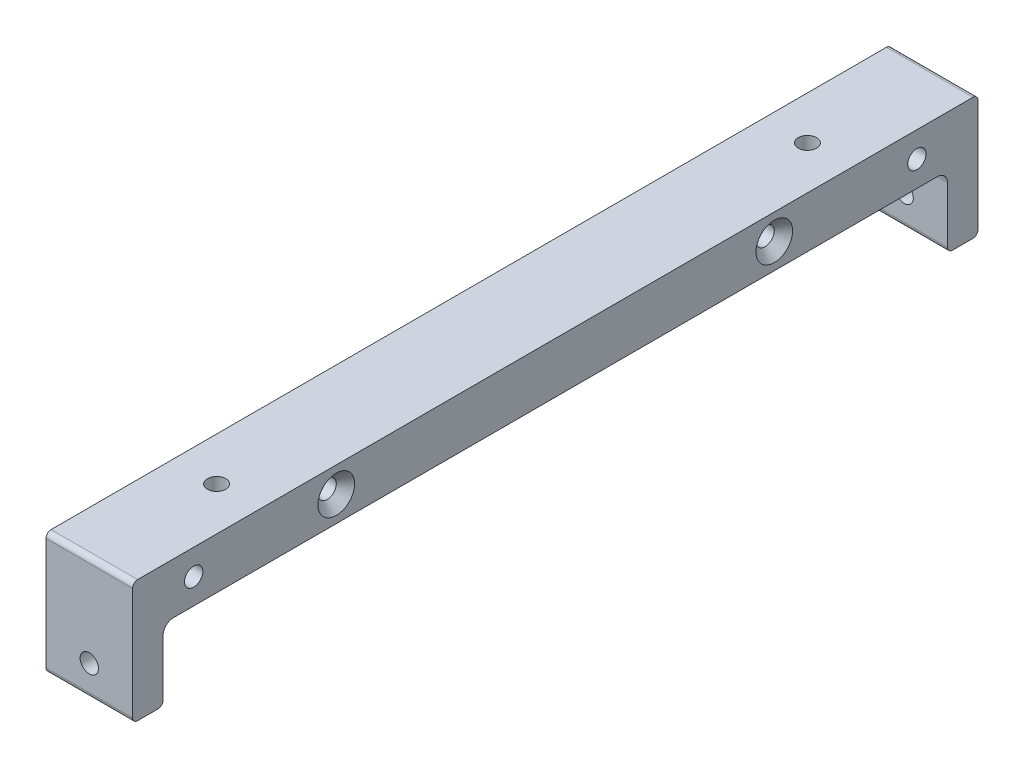
ISO-10303-21;
HEADER;
FILE_DESCRIPTION(('STEP AP214'),'2;1');
FILE_NAME('part.step','',(''),(''),'','','');
FILE_SCHEMA(('AUTOMOTIVE_DESIGN { 1 0 10303 214 1 1 1 1 }'));
ENDSEC;
DATA;
#1=APPLICATION_CONTEXT('core data for automotive mechanical design processes');
#2=APPLICATION_PROTOCOL_DEFINITION('international standard','automotive_design',2000,#1);
#3=PRODUCT_CONTEXT('',#1,'mechanical');
#4=PRODUCT('Part','Part','',(#3));
#5=PRODUCT_RELATED_PRODUCT_CATEGORY('part','',(#4));
#6=PRODUCT_DEFINITION_FORMATION('','',#4);
#7=PRODUCT_DEFINITION_CONTEXT('part definition',#1,'design');
#8=PRODUCT_DEFINITION('design','',#6,#7);
#9=PRODUCT_DEFINITION_SHAPE('','',#8);
#10=(LENGTH_UNIT() NAMED_UNIT(*) SI_UNIT(.MILLI.,.METRE.));
#11=(NAMED_UNIT(*) PLANE_ANGLE_UNIT() SI_UNIT($,.RADIAN.));
#12=(NAMED_UNIT(*) SI_UNIT($,.STERADIAN.) SOLID_ANGLE_UNIT());
#13=UNCERTAINTY_MEASURE_WITH_UNIT(LENGTH_MEASURE(1.E-05),#10,'distance_accuracy_value','');
#14=(GEOMETRIC_REPRESENTATION_CONTEXT(3) GLOBAL_UNCERTAINTY_ASSIGNED_CONTEXT((#13)) GLOBAL_UNIT_ASSIGNED_CONTEXT((#10,
#11,#12)) REPRESENTATION_CONTEXT('',''));
#15=CARTESIAN_POINT('',(0.,0.,0.));
#16=DIRECTION('',(0.,0.,1.));
#17=DIRECTION('',(1.,0.,0.));
#18=AXIS2_PLACEMENT_3D('',#15,#16,#17);
#19=CARTESIAN_POINT('',(-4.25,-6.,41.5));
#20=DIRECTION('',(0.,1.,0.));
#21=DIRECTION('',(0.,0.,1.));
#22=AXIS2_PLACEMENT_3D('',#19,#20,#21);
#23=PLANE('',#22);
#24=DIRECTION('',(0.,0.,-1.));
#25=VECTOR('',#24,1.);
#26=CARTESIAN_POINT('',(-4.25,-6.,41.5));
#27=LINE('',#26,#25);
#28=CARTESIAN_POINT('',(-4.25,-6.,41.));
#29=VERTEX_POINT('',#28);
#30=CARTESIAN_POINT('',(-4.25,-6.,39.));
#31=VERTEX_POINT('',#30);
#32=EDGE_CURVE('E281',#29,#31,#27,.T.);
#33=ORIENTED_EDGE('',*,*,#32,.T.);
#34=DIRECTION('',(1.,0.,0.));
#35=VECTOR('',#34,1.);
#36=CARTESIAN_POINT('',(-4.25,-6.,39.));
#37=LINE('',#36,#35);
#38=CARTESIAN_POINT('',(4.25,-6.,39.));
#39=VERTEX_POINT('',#38);
#40=EDGE_CURVE('E326',#31,#39,#37,.T.);
#41=ORIENTED_EDGE('',*,*,#40,.T.);
#42=DIRECTION('',(0.,0.,-1.));
#43=VECTOR('',#42,1.);
#44=CARTESIAN_POINT('',(4.25,-6.,41.5));
#45=LINE('',#44,#43);
#46=CARTESIAN_POINT('',(4.25,-6.,41.));
#47=VERTEX_POINT('',#46);
#48=EDGE_CURVE('E277',#47,#39,#45,.T.);
#49=ORIENTED_EDGE('',*,*,#48,.F.);
#50=DIRECTION('',(1.,0.,0.));
#51=VECTOR('',#50,1.);
#52=CARTESIAN_POINT('',(-4.25,-6.,41.));
#53=LINE('',#52,#51);
#54=EDGE_CURVE('E324',#47,#29,#53,.F.);
#55=ORIENTED_EDGE('',*,*,#54,.T.);
#56=EDGE_LOOP('',(#33,#41,#49,#55));
#57=FACE_BOUND('',#56,.T.);
#58=ADVANCED_FACE('F33',(#57),#23,.F.);
#59=CARTESIAN_POINT('',(4.25,-6.,41.5));
#60=DIRECTION('',(-1.,0.,0.));
#61=DIRECTION('',(0.,0.,1.));
#62=AXIS2_PLACEMENT_3D('',#59,#60,#61);
#63=PLANE('',#62);
#64=CARTESIAN_POINT('',(4.25,3.5,35.5));
#65=DIRECTION('',(1.,0.,0.));
#66=DIRECTION('',(0.,0.,-1.));
#67=AXIS2_PLACEMENT_3D('',#64,#65,#66);
#68=CIRCLE('',#67,0.89999999999999);
#69=CARTESIAN_POINT('',(4.25,3.5,34.6));
#70=VERTEX_POINT('',#69);
#71=EDGE_CURVE('E188',#70,#70,#68,.T.);
#72=ORIENTED_EDGE('',*,*,#71,.F.);
#73=EDGE_LOOP('',(#72));
#74=FACE_BOUND('',#73,.T.);
#75=CARTESIAN_POINT('',(4.25,3.5,-35.5));
#76=DIRECTION('',(1.,0.,0.));
#77=DIRECTION('',(0.,0.,-1.));
#78=AXIS2_PLACEMENT_3D('',#75,#76,#77);
#79=CIRCLE('',#78,0.899999999999989);
#80=CARTESIAN_POINT('',(4.25,3.5,-36.4));
#81=VERTEX_POINT('',#80);
#82=EDGE_CURVE('E194',#81,#81,#79,.T.);
#83=ORIENTED_EDGE('',*,*,#82,.F.);
#84=EDGE_LOOP('',(#83));
#85=FACE_BOUND('',#84,.T.);
#86=CARTESIAN_POINT('',(4.25,3.5,21.5));
#87=DIRECTION('',(1.,0.,0.));
#88=DIRECTION('',(0.,0.,-1.));
#89=AXIS2_PLACEMENT_3D('',#86,#87,#88);
#90=CIRCLE('',#89,1.8);
#91=CARTESIAN_POINT('',(4.25,3.5,19.7));
#92=VERTEX_POINT('',#91);
#93=EDGE_CURVE('E209',#92,#92,#90,.T.);
#94=ORIENTED_EDGE('',*,*,#93,.F.);
#95=EDGE_LOOP('',(#94));
#96=FACE_BOUND('',#95,.T.);
#97=CARTESIAN_POINT('',(4.25,3.5,-21.5));
#98=DIRECTION('',(1.,0.,0.));
#99=DIRECTION('',(0.,0.,-1.));
#100=AXIS2_PLACEMENT_3D('',#97,#98,#99);
#101=CIRCLE('',#100,1.8);
#102=CARTESIAN_POINT('',(4.25,3.5,-23.3));
#103=VERTEX_POINT('',#102);
#104=EDGE_CURVE('E218',#103,#103,#101,.T.);
#105=ORIENTED_EDGE('',*,*,#104,.F.);
#106=EDGE_LOOP('',(#105));
#107=FACE_BOUND('',#106,.T.);
#108=CARTESIAN_POINT('',(4.25,-6.,-39.));
#109=VERTEX_POINT('',#108);
#110=CARTESIAN_POINT('',(4.25,-6.,-41.));
#111=VERTEX_POINT('',#110);
#112=EDGE_CURVE('E272',#109,#111,#45,.T.);
#113=ORIENTED_EDGE('',*,*,#112,.T.);
#114=CARTESIAN_POINT('',(4.25,-5.5,-41.));
#115=DIRECTION('',(-1.,0.,0.));
#116=DIRECTION('',(0.,0.,1.));
#117=AXIS2_PLACEMENT_3D('',#114,#115,#116);
#118=CIRCLE('',#117,0.5);
#119=CARTESIAN_POINT('',(4.25,-5.5,-41.5));
#120=VERTEX_POINT('',#119);
#121=EDGE_CURVE('E305',#111,#120,#118,.F.);
#122=ORIENTED_EDGE('',*,*,#121,.T.);
#123=DIRECTION('',(0.,1.,0.));
#124=VECTOR('',#123,1.);
#125=CARTESIAN_POINT('',(4.25,-6.,-41.5));
#126=LINE('',#125,#124);
#127=CARTESIAN_POINT('',(4.25,5.5,-41.5));
#128=VERTEX_POINT('',#127);
#129=EDGE_CURVE('E258',#120,#128,#126,.T.);
#130=ORIENTED_EDGE('',*,*,#129,.T.);
#131=CARTESIAN_POINT('',(4.25,5.5,-41.));
#132=DIRECTION('',(-1.,0.,0.));
#133=DIRECTION('',(0.,0.,1.));
#134=AXIS2_PLACEMENT_3D('',#131,#132,#133);
#135=CIRCLE('',#134,0.5);
#136=CARTESIAN_POINT('',(4.25,6.,-41.));
#137=VERTEX_POINT('',#136);
#138=EDGE_CURVE('E297',#128,#137,#135,.F.);
#139=ORIENTED_EDGE('',*,*,#138,.T.);
#140=DIRECTION('',(0.,0.,-1.));
#141=VECTOR('',#140,1.);
#142=CARTESIAN_POINT('',(4.25,6.,41.5));
#143=LINE('',#142,#141);
#144=CARTESIAN_POINT('',(4.25,6.,41.));
#145=VERTEX_POINT('',#144);
#146=EDGE_CURVE('E287',#145,#137,#143,.T.);
#147=ORIENTED_EDGE('',*,*,#146,.F.);
#148=CARTESIAN_POINT('',(4.25,5.5,41.));
#149=DIRECTION('',(-1.,0.,0.));
#150=DIRECTION('',(0.,0.,1.));
#151=AXIS2_PLACEMENT_3D('',#148,#149,#150);
#152=CIRCLE('',#151,0.5);
#153=CARTESIAN_POINT('',(4.25,5.5,41.5));
#154=VERTEX_POINT('',#153);
#155=EDGE_CURVE('E295',#145,#154,#152,.F.);
#156=ORIENTED_EDGE('',*,*,#155,.T.);
#157=DIRECTION('',(0.,1.,0.));
#158=VECTOR('',#157,1.);
#159=CARTESIAN_POINT('',(4.25,-6.,41.5));
#160=LINE('',#159,#158);
#161=CARTESIAN_POINT('',(4.25,-5.5,41.5));
#162=VERTEX_POINT('',#161);
#163=EDGE_CURVE('E265',#162,#154,#160,.T.);
#164=ORIENTED_EDGE('',*,*,#163,.F.);
#165=CARTESIAN_POINT('',(4.25,-5.5,41.));
#166=DIRECTION('',(-1.,0.,0.));
#167=DIRECTION('',(0.,0.,1.));
#168=AXIS2_PLACEMENT_3D('',#165,#166,#167);
#169=CIRCLE('',#168,0.5);
#170=EDGE_CURVE('E299',#162,#47,#169,.F.);
#171=ORIENTED_EDGE('',*,*,#170,.T.);
#172=ORIENTED_EDGE('',*,*,#48,.T.);
#173=CARTESIAN_POINT('',(4.25,-5.5,39.));
#174=DIRECTION('',(-1.,0.,0.));
#175=DIRECTION('',(0.,0.,1.));
#176=AXIS2_PLACEMENT_3D('',#173,#174,#175);
#177=CIRCLE('',#176,0.5);
#178=CARTESIAN_POINT('',(4.25,-5.5,38.5));
#179=VERTEX_POINT('',#178);
#180=EDGE_CURVE('E301',#39,#179,#177,.F.);
#181=ORIENTED_EDGE('',*,*,#180,.T.);
#182=DIRECTION('',(0.,-1.,0.));
#183=VECTOR('',#182,1.);
#184=CARTESIAN_POINT('',(4.25,-6.00000000000001,38.5));
#185=LINE('',#184,#183);
#186=CARTESIAN_POINT('',(4.25,0.,38.5));
#187=VERTEX_POINT('',#186);
#188=EDGE_CURVE('E231',#187,#179,#185,.T.);
#189=ORIENTED_EDGE('',*,*,#188,.F.);
#190=CARTESIAN_POINT('',(4.25,0.,37.5));
#191=DIRECTION('',(1.,0.,0.));
#192=DIRECTION('',(0.,0.,-1.));
#193=AXIS2_PLACEMENT_3D('',#190,#191,#192);
#194=CIRCLE('',#193,1.);
#195=CARTESIAN_POINT('',(4.25,1.,37.5));
#196=VERTEX_POINT('',#195);
#197=EDGE_CURVE('E251',#196,#187,#194,.T.);
#198=ORIENTED_EDGE('',*,*,#197,.F.);
#199=DIRECTION('',(0.,0.,1.));
#200=VECTOR('',#199,1.);
#201=CARTESIAN_POINT('',(4.25,1.,37.5));
#202=LINE('',#201,#200);
#203=CARTESIAN_POINT('',(4.25,1.,-37.5));
#204=VERTEX_POINT('',#203);
#205=EDGE_CURVE('E248',#204,#196,#202,.T.);
#206=ORIENTED_EDGE('',*,*,#205,.F.);
#207=CARTESIAN_POINT('',(4.25,0.,-37.5));
#208=DIRECTION('',(1.,0.,0.));
#209=DIRECTION('',(0.,0.,1.));
#210=AXIS2_PLACEMENT_3D('',#207,#208,#209);
#211=CIRCLE('',#210,1.);
#212=CARTESIAN_POINT('',(4.25,0.,-38.5));
#213=VERTEX_POINT('',#212);
#214=EDGE_CURVE('E245',#213,#204,#211,.T.);
#215=ORIENTED_EDGE('',*,*,#214,.F.);
#216=DIRECTION('',(0.,1.,0.));
#217=VECTOR('',#216,1.);
#218=CARTESIAN_POINT('',(4.25,0.,-38.5));
#219=LINE('',#218,#217);
#220=CARTESIAN_POINT('',(4.25,-5.5,-38.5));
#221=VERTEX_POINT('',#220);
#222=EDGE_CURVE('E227',#221,#213,#219,.T.);
#223=ORIENTED_EDGE('',*,*,#222,.F.);
#224=CARTESIAN_POINT('',(4.25,-5.5,-39.));
#225=DIRECTION('',(-1.,0.,0.));
#226=DIRECTION('',(0.,0.,1.));
#227=AXIS2_PLACEMENT_3D('',#224,#225,#226);
#228=CIRCLE('',#227,0.5);
#229=EDGE_CURVE('E303',#221,#109,#228,.F.);
#230=ORIENTED_EDGE('',*,*,#229,.T.);
#231=EDGE_LOOP('',(#113,#122,#130,#139,#147,#156,#164,#171,#172,#181,#189,#198,#206,#215,#223,#230));
#232=FACE_BOUND('',#231,.T.);
#233=ADVANCED_FACE('F346',(#74,#85,#96,#107,#232),#63,.F.);
#234=CARTESIAN_POINT('',(-4.25,6.,41.5));
#235=DIRECTION('',(0.,-1.,0.));
#236=DIRECTION('',(0.,0.,-1.));
#237=AXIS2_PLACEMENT_3D('',#234,#235,#236);
#238=PLANE('',#237);
#239=CARTESIAN_POINT('',(0.,6.,-29.));
#240=DIRECTION('',(0.,1.,0.));
#241=DIRECTION('',(0.,0.,1.));
#242=AXIS2_PLACEMENT_3D('',#239,#240,#241);
#243=CIRCLE('',#242,0.899999999999989);
#244=CARTESIAN_POINT('',(0.,6.,-28.1));
#245=VERTEX_POINT('',#244);
#246=EDGE_CURVE('E172',#245,#245,#243,.T.);
#247=ORIENTED_EDGE('',*,*,#246,.F.);
#248=EDGE_LOOP('',(#247));
#249=FACE_BOUND('',#248,.T.);
#250=CARTESIAN_POINT('',(0.,6.,29.));
#251=DIRECTION('',(0.,1.,0.));
#252=DIRECTION('',(0.,0.,1.));
#253=AXIS2_PLACEMENT_3D('',#250,#251,#252);
#254=CIRCLE('',#253,0.899999999999989);
#255=CARTESIAN_POINT('',(0.,6.,29.9));
#256=VERTEX_POINT('',#255);
#257=EDGE_CURVE('E171',#256,#256,#254,.T.);
#258=ORIENTED_EDGE('',*,*,#257,.F.);
#259=EDGE_LOOP('',(#258));
#260=FACE_BOUND('',#259,.T.);
#261=ORIENTED_EDGE('',*,*,#146,.T.);
#262=DIRECTION('',(-1.,0.,0.));
#263=VECTOR('',#262,1.);
#264=CARTESIAN_POINT('',(-4.25,6.,-41.));
#265=LINE('',#264,#263);
#266=CARTESIAN_POINT('',(-4.25,6.,-41.));
#267=VERTEX_POINT('',#266);
#268=EDGE_CURVE('E11',#137,#267,#265,.T.);
#269=ORIENTED_EDGE('',*,*,#268,.T.);
#270=DIRECTION('',(0.,0.,-1.));
#271=VECTOR('',#270,1.);
#272=CARTESIAN_POINT('',(-4.25,6.,41.5));
#273=LINE('',#272,#271);
#274=CARTESIAN_POINT('',(-4.25,6.,41.));
#275=VERTEX_POINT('',#274);
#276=EDGE_CURVE('E284',#275,#267,#273,.T.);
#277=ORIENTED_EDGE('',*,*,#276,.F.);
#278=DIRECTION('',(-1.,0.,0.));
#279=VECTOR('',#278,1.);
#280=CARTESIAN_POINT('',(-4.25,6.,41.));
#281=LINE('',#280,#279);
#282=EDGE_CURVE('E42',#275,#145,#281,.F.);
#283=ORIENTED_EDGE('',*,*,#282,.T.);
#284=EDGE_LOOP('',(#261,#269,#277,#283));
#285=FACE_BOUND('',#284,.T.);
#286=ADVANCED_FACE('F341',(#249,#260,#285),#238,.F.);
#287=CARTESIAN_POINT('',(-4.25,-6.,41.5));
#288=DIRECTION('',(1.,0.,0.));
#289=DIRECTION('',(0.,0.,-1.));
#290=AXIS2_PLACEMENT_3D('',#287,#288,#289);
#291=PLANE('',#290);
#292=CARTESIAN_POINT('',(-4.25,3.5,0.));
#293=DIRECTION('',(-1.,0.,0.));
#294=DIRECTION('',(0.,0.,1.));
#295=AXIS2_PLACEMENT_3D('',#292,#293,#294);
#296=CIRCLE('',#295,0.89999999999999);
#297=CARTESIAN_POINT('',(-4.25,3.5,0.89999999999999));
#298=VERTEX_POINT('',#297);
#299=EDGE_CURVE('E182',#298,#298,#296,.T.);
#300=ORIENTED_EDGE('',*,*,#299,.F.);
#301=EDGE_LOOP('',(#300));
#302=FACE_BOUND('',#301,.T.);
#303=CARTESIAN_POINT('',(-4.25,3.5,21.5));
#304=DIRECTION('',(1.,0.,0.));
#305=DIRECTION('',(0.,0.,-1.));
#306=AXIS2_PLACEMENT_3D('',#303,#304,#305);
#307=CIRCLE('',#306,0.899999999999998);
#308=CARTESIAN_POINT('',(-4.25,3.5,20.6));
#309=VERTEX_POINT('',#308);
#310=EDGE_CURVE('E215',#309,#309,#307,.T.);
#311=ORIENTED_EDGE('',*,*,#310,.T.);
#312=EDGE_LOOP('',(#311));
#313=FACE_BOUND('',#312,.T.);
#314=CARTESIAN_POINT('',(-4.25,3.5,-21.5));
#315=DIRECTION('',(1.,0.,0.));
#316=DIRECTION('',(0.,0.,-1.));
#317=AXIS2_PLACEMENT_3D('',#314,#315,#316);
#318=CIRCLE('',#317,0.899999999999998);
#319=CARTESIAN_POINT('',(-4.25,3.5,-22.4));
#320=VERTEX_POINT('',#319);
#321=EDGE_CURVE('E224',#320,#320,#318,.T.);
#322=ORIENTED_EDGE('',*,*,#321,.T.);
#323=EDGE_LOOP('',(#322));
#324=FACE_BOUND('',#323,.T.);
#325=DIRECTION('',(0.,-1.,0.));
#326=VECTOR('',#325,1.);
#327=CARTESIAN_POINT('',(-4.25,-6.,-41.5));
#328=LINE('',#327,#326);
#329=CARTESIAN_POINT('',(-4.25,5.5,-41.5));
#330=VERTEX_POINT('',#329);
#331=CARTESIAN_POINT('',(-4.25,-5.5,-41.5));
#332=VERTEX_POINT('',#331);
#333=EDGE_CURVE('E269',#330,#332,#328,.T.);
#334=ORIENTED_EDGE('',*,*,#333,.T.);
#335=CARTESIAN_POINT('',(-4.25,-5.5,-41.));
#336=DIRECTION('',(1.,0.,0.));
#337=DIRECTION('',(0.,0.,-1.));
#338=AXIS2_PLACEMENT_3D('',#335,#336,#337);
#339=CIRCLE('',#338,0.5);
#340=CARTESIAN_POINT('',(-4.25,-6.,-41.));
#341=VERTEX_POINT('',#340);
#342=EDGE_CURVE('E319',#332,#341,#339,.F.);
#343=ORIENTED_EDGE('',*,*,#342,.T.);
#344=CARTESIAN_POINT('',(-4.25,-6.,-39.));
#345=VERTEX_POINT('',#344);
#346=EDGE_CURVE('E280',#345,#341,#27,.T.);
#347=ORIENTED_EDGE('',*,*,#346,.F.);
#348=CARTESIAN_POINT('',(-4.25,-5.5,-39.));
#349=DIRECTION('',(1.,0.,0.));
#350=DIRECTION('',(0.,0.,-1.));
#351=AXIS2_PLACEMENT_3D('',#348,#349,#350);
#352=CIRCLE('',#351,0.5);
#353=CARTESIAN_POINT('',(-4.25,-5.5,-38.5));
#354=VERTEX_POINT('',#353);
#355=EDGE_CURVE('E49',#345,#354,#352,.F.);
#356=ORIENTED_EDGE('',*,*,#355,.T.);
#357=DIRECTION('',(0.,1.,0.));
#358=VECTOR('',#357,1.);
#359=CARTESIAN_POINT('',(-4.25,0.,-38.5));
#360=LINE('',#359,#358);
#361=CARTESIAN_POINT('',(-4.25,0.,-38.5));
#362=VERTEX_POINT('',#361);
#363=EDGE_CURVE('E228',#354,#362,#360,.T.);
#364=ORIENTED_EDGE('',*,*,#363,.T.);
#365=CARTESIAN_POINT('',(-4.25,0.,-37.5));
#366=DIRECTION('',(1.,0.,0.));
#367=DIRECTION('',(0.,0.,1.));
#368=AXIS2_PLACEMENT_3D('',#365,#366,#367);
#369=CIRCLE('',#368,1.);
#370=CARTESIAN_POINT('',(-4.25,1.,-37.5));
#371=VERTEX_POINT('',#370);
#372=EDGE_CURVE('E230',#362,#371,#369,.T.);
#373=ORIENTED_EDGE('',*,*,#372,.T.);
#374=DIRECTION('',(0.,0.,1.));
#375=VECTOR('',#374,1.);
#376=CARTESIAN_POINT('',(-4.25,1.,37.5));
#377=LINE('',#376,#375);
#378=CARTESIAN_POINT('',(-4.25,1.,37.5));
#379=VERTEX_POINT('',#378);
#380=EDGE_CURVE('E234',#371,#379,#377,.T.);
#381=ORIENTED_EDGE('',*,*,#380,.T.);
#382=CARTESIAN_POINT('',(-4.25,0.,37.5));
#383=DIRECTION('',(1.,0.,0.));
#384=DIRECTION('',(0.,0.,-1.));
#385=AXIS2_PLACEMENT_3D('',#382,#383,#384);
#386=CIRCLE('',#385,1.);
#387=CARTESIAN_POINT('',(-4.25,0.,38.5));
#388=VERTEX_POINT('',#387);
#389=EDGE_CURVE('E237',#379,#388,#386,.T.);
#390=ORIENTED_EDGE('',*,*,#389,.T.);
#391=DIRECTION('',(0.,-1.,0.));
#392=VECTOR('',#391,1.);
#393=CARTESIAN_POINT('',(-4.25,-6.00000000000001,38.5));
#394=LINE('',#393,#392);
#395=CARTESIAN_POINT('',(-4.25,-5.5,38.5));
#396=VERTEX_POINT('',#395);
#397=EDGE_CURVE('E240',#388,#396,#394,.T.);
#398=ORIENTED_EDGE('',*,*,#397,.T.);
#399=CARTESIAN_POINT('',(-4.25,-5.5,39.));
#400=DIRECTION('',(1.,0.,0.));
#401=DIRECTION('',(0.,0.,-1.));
#402=AXIS2_PLACEMENT_3D('',#399,#400,#401);
#403=CIRCLE('',#402,0.5);
#404=EDGE_CURVE('E316',#396,#31,#403,.F.);
#405=ORIENTED_EDGE('',*,*,#404,.T.);
#406=ORIENTED_EDGE('',*,*,#32,.F.);
#407=CARTESIAN_POINT('',(-4.25,-5.5,41.));
#408=DIRECTION('',(1.,0.,0.));
#409=DIRECTION('',(0.,0.,-1.));
#410=AXIS2_PLACEMENT_3D('',#407,#408,#409);
#411=CIRCLE('',#410,0.5);
#412=CARTESIAN_POINT('',(-4.25,-5.5,41.5));
#413=VERTEX_POINT('',#412);
#414=EDGE_CURVE('E314',#29,#413,#411,.F.);
#415=ORIENTED_EDGE('',*,*,#414,.T.);
#416=DIRECTION('',(0.,-1.,0.));
#417=VECTOR('',#416,1.);
#418=CARTESIAN_POINT('',(-4.25,-6.,41.5));
#419=LINE('',#418,#417);
#420=CARTESIAN_POINT('',(-4.25,5.5,41.5));
#421=VERTEX_POINT('',#420);
#422=EDGE_CURVE('E268',#421,#413,#419,.T.);
#423=ORIENTED_EDGE('',*,*,#422,.F.);
#424=CARTESIAN_POINT('',(-4.25,5.5,41.));
#425=DIRECTION('',(1.,0.,0.));
#426=DIRECTION('',(0.,0.,-1.));
#427=AXIS2_PLACEMENT_3D('',#424,#425,#426);
#428=CIRCLE('',#427,0.5);
#429=EDGE_CURVE('E311',#421,#275,#428,.F.);
#430=ORIENTED_EDGE('',*,*,#429,.T.);
#431=ORIENTED_EDGE('',*,*,#276,.T.);
#432=CARTESIAN_POINT('',(-4.25,5.5,-41.));
#433=DIRECTION('',(1.,0.,0.));
#434=DIRECTION('',(0.,0.,-1.));
#435=AXIS2_PLACEMENT_3D('',#432,#433,#434);
#436=CIRCLE('',#435,0.5);
#437=EDGE_CURVE('E57',#267,#330,#436,.F.);
#438=ORIENTED_EDGE('',*,*,#437,.T.);
#439=EDGE_LOOP('',(#334,#343,#347,#356,#364,#373,#381,#390,#398,#405,#406,#415,#423,#430,#431,#438));
#440=FACE_BOUND('',#439,.T.);
#441=ADVANCED_FACE('F354',(#302,#313,#324,#440),#291,.F.);
#442=ORIENTED_EDGE('',*,*,#346,.T.);
#443=DIRECTION('',(1.,0.,0.));
#444=VECTOR('',#443,1.);
#445=CARTESIAN_POINT('',(4.25,-6.,-41.));
#446=LINE('',#445,#444);
#447=EDGE_CURVE('E292',#341,#111,#446,.T.);
#448=ORIENTED_EDGE('',*,*,#447,.T.);
#449=ORIENTED_EDGE('',*,*,#112,.F.);
#450=DIRECTION('',(1.,0.,0.));
#451=VECTOR('',#450,1.);
#452=CARTESIAN_POINT('',(-4.25,-6.,-39.));
#453=LINE('',#452,#451);
#454=EDGE_CURVE('E290',#109,#345,#453,.F.);
#455=ORIENTED_EDGE('',*,*,#454,.T.);
#456=EDGE_LOOP('',(#442,#448,#449,#455));
#457=FACE_BOUND('',#456,.T.);
#458=ADVANCED_FACE('F393',(#457),#23,.F.);
#459=CARTESIAN_POINT('',(0.,0.,41.5));
#460=DIRECTION('',(0.,0.,-1.));
#461=DIRECTION('',(-1.,0.,0.));
#462=AXIS2_PLACEMENT_3D('',#459,#460,#461);
#463=PLANE('',#462);
#464=CARTESIAN_POINT('',(0.,-3.,41.5));
#465=DIRECTION('',(0.,0.,1.));
#466=DIRECTION('',(1.,0.,0.));
#467=AXIS2_PLACEMENT_3D('',#464,#465,#466);
#468=CIRCLE('',#467,0.899999999999989);
#469=CARTESIAN_POINT('',(0.899999999999989,-3.,41.5));
#470=VERTEX_POINT('',#469);
#471=EDGE_CURVE('E200',#470,#470,#468,.T.);
#472=ORIENTED_EDGE('',*,*,#471,.F.);
#473=EDGE_LOOP('',(#472));
#474=FACE_BOUND('',#473,.T.);
#475=ORIENTED_EDGE('',*,*,#422,.T.);
#476=DIRECTION('',(1.,0.,0.));
#477=VECTOR('',#476,1.);
#478=CARTESIAN_POINT('',(0.,-5.5,41.5));
#479=LINE('',#478,#477);
#480=EDGE_CURVE('E334',#413,#162,#479,.T.);
#481=ORIENTED_EDGE('',*,*,#480,.T.);
#482=ORIENTED_EDGE('',*,*,#163,.T.);
#483=DIRECTION('',(-1.,0.,0.));
#484=VECTOR('',#483,1.);
#485=CARTESIAN_POINT('',(0.,5.5,41.5));
#486=LINE('',#485,#484);
#487=EDGE_CURVE('E331',#154,#421,#486,.T.);
#488=ORIENTED_EDGE('',*,*,#487,.T.);
#489=EDGE_LOOP('',(#475,#481,#482,#488));
#490=FACE_BOUND('',#489,.T.);
#491=ADVANCED_FACE('F352',(#474,#490),#463,.F.);
#492=CARTESIAN_POINT('',(0.,0.,-41.5));
#493=DIRECTION('',(0.,0.,-1.));
#494=DIRECTION('',(-1.,0.,0.));
#495=AXIS2_PLACEMENT_3D('',#492,#493,#494);
#496=PLANE('',#495);
#497=CARTESIAN_POINT('',(0.,-3.,-41.5));
#498=DIRECTION('',(0.,0.,-1.));
#499=DIRECTION('',(-1.,0.,0.));
#500=AXIS2_PLACEMENT_3D('',#497,#498,#499);
#501=CIRCLE('',#500,0.899999999999977);
#502=CARTESIAN_POINT('',(-0.899999999999977,-3.,-41.5));
#503=VERTEX_POINT('',#502);
#504=EDGE_CURVE('E206',#503,#503,#501,.T.);
#505=ORIENTED_EDGE('',*,*,#504,.F.);
#506=EDGE_LOOP('',(#505));
#507=FACE_BOUND('',#506,.T.);
#508=ORIENTED_EDGE('',*,*,#129,.F.);
#509=DIRECTION('',(1.,0.,0.));
#510=VECTOR('',#509,1.);
#511=CARTESIAN_POINT('',(-4.25,-5.5,-41.5));
#512=LINE('',#511,#510);
#513=EDGE_CURVE('E309',#120,#332,#512,.F.);
#514=ORIENTED_EDGE('',*,*,#513,.T.);
#515=ORIENTED_EDGE('',*,*,#333,.F.);
#516=DIRECTION('',(-1.,0.,0.));
#517=VECTOR('',#516,1.);
#518=CARTESIAN_POINT('',(4.25,5.5,-41.5));
#519=LINE('',#518,#517);
#520=EDGE_CURVE('E307',#330,#128,#519,.F.);
#521=ORIENTED_EDGE('',*,*,#520,.T.);
#522=EDGE_LOOP('',(#508,#514,#515,#521));
#523=FACE_BOUND('',#522,.T.);
#524=ADVANCED_FACE('F421',(#507,#523),#496,.T.);
#525=CARTESIAN_POINT('',(-4.25,-6.00000000000001,38.5));
#526=DIRECTION('',(0.,0.,1.));
#527=DIRECTION('',(1.,0.,0.));
#528=AXIS2_PLACEMENT_3D('',#525,#526,#527);
#529=PLANE('',#528);
#530=CARTESIAN_POINT('',(0.,-3.,38.5));
#531=DIRECTION('',(0.,0.,1.));
#532=DIRECTION('',(1.,0.,0.));
#533=AXIS2_PLACEMENT_3D('',#530,#531,#532);
#534=CIRCLE('',#533,0.899999999999977);
#535=CARTESIAN_POINT('',(0.899999999999977,-3.,38.5));
#536=VERTEX_POINT('',#535);
#537=EDGE_CURVE('E203',#536,#536,#534,.T.);
#538=ORIENTED_EDGE('',*,*,#537,.T.);
#539=EDGE_LOOP('',(#538));
#540=FACE_BOUND('',#539,.T.);
#541=ORIENTED_EDGE('',*,*,#188,.T.);
#542=DIRECTION('',(1.,0.,0.));
#543=VECTOR('',#542,1.);
#544=CARTESIAN_POINT('',(-4.25,-5.5,38.5));
#545=LINE('',#544,#543);
#546=EDGE_CURVE('E329',#179,#396,#545,.F.);
#547=ORIENTED_EDGE('',*,*,#546,.T.);
#548=ORIENTED_EDGE('',*,*,#397,.F.);
#549=DIRECTION('',(1.,0.,0.));
#550=VECTOR('',#549,1.);
#551=CARTESIAN_POINT('',(-4.25,0.,38.5));
#552=LINE('',#551,#550);
#553=EDGE_CURVE('E256',#388,#187,#552,.T.);
#554=ORIENTED_EDGE('',*,*,#553,.T.);
#555=EDGE_LOOP('',(#541,#547,#548,#554));
#556=FACE_BOUND('',#555,.T.);
#557=ADVANCED_FACE('F370',(#540,#556),#529,.F.);
#558=CARTESIAN_POINT('',(-4.25,0.,37.5));
#559=DIRECTION('',(1.,0.,0.));
#560=DIRECTION('',(0.,0.,-1.));
#561=AXIS2_PLACEMENT_3D('',#558,#559,#560);
#562=CYLINDRICAL_SURFACE('',#561,1.);
#563=ORIENTED_EDGE('',*,*,#197,.T.);
#564=ORIENTED_EDGE('',*,*,#553,.F.);
#565=ORIENTED_EDGE('',*,*,#389,.F.);
#566=DIRECTION('',(1.,0.,0.));
#567=VECTOR('',#566,1.);
#568=CARTESIAN_POINT('',(-4.25,1.,37.5));
#569=LINE('',#568,#567);
#570=EDGE_CURVE('E259',#379,#196,#569,.T.);
#571=ORIENTED_EDGE('',*,*,#570,.T.);
#572=EDGE_LOOP('',(#563,#564,#565,#571));
#573=FACE_BOUND('',#572,.T.);
#574=ADVANCED_FACE('F374',(#573),#562,.F.);
#575=CARTESIAN_POINT('',(-4.25,1.,37.5));
#576=DIRECTION('',(0.,1.,0.));
#577=DIRECTION('',(0.,0.,1.));
#578=AXIS2_PLACEMENT_3D('',#575,#576,#577);
#579=PLANE('',#578);
#580=ORIENTED_EDGE('',*,*,#205,.T.);
#581=ORIENTED_EDGE('',*,*,#570,.F.);
#582=ORIENTED_EDGE('',*,*,#380,.F.);
#583=DIRECTION('',(1.,0.,0.));
#584=VECTOR('',#583,1.);
#585=CARTESIAN_POINT('',(-4.25,1.,-37.5));
#586=LINE('',#585,#584);
#587=EDGE_CURVE('E261',#371,#204,#586,.T.);
#588=ORIENTED_EDGE('',*,*,#587,.T.);
#589=EDGE_LOOP('',(#580,#581,#582,#588));
#590=FACE_BOUND('',#589,.T.);
#591=ADVANCED_FACE('F379',(#590),#579,.F.);
#592=CARTESIAN_POINT('',(-4.25,0.,-37.5));
#593=DIRECTION('',(1.,0.,0.));
#594=DIRECTION('',(0.,0.,-1.));
#595=AXIS2_PLACEMENT_3D('',#592,#593,#594);
#596=CYLINDRICAL_SURFACE('',#595,1.);
#597=ORIENTED_EDGE('',*,*,#214,.T.);
#598=ORIENTED_EDGE('',*,*,#587,.F.);
#599=ORIENTED_EDGE('',*,*,#372,.F.);
#600=DIRECTION('',(1.,0.,0.));
#601=VECTOR('',#600,1.);
#602=CARTESIAN_POINT('',(-4.25,0.,-38.5));
#603=LINE('',#602,#601);
#604=EDGE_CURVE('E243',#362,#213,#603,.T.);
#605=ORIENTED_EDGE('',*,*,#604,.T.);
#606=EDGE_LOOP('',(#597,#598,#599,#605));
#607=FACE_BOUND('',#606,.T.);
#608=ADVANCED_FACE('F383',(#607),#596,.F.);
#609=CARTESIAN_POINT('',(-4.25,0.,-38.5));
#610=DIRECTION('',(0.,0.,-1.));
#611=DIRECTION('',(0.,1.,0.));
#612=AXIS2_PLACEMENT_3D('',#609,#610,#611);
#613=PLANE('',#612);
#614=CARTESIAN_POINT('',(0.,-3.,-38.5));
#615=DIRECTION('',(0.,0.,-1.));
#616=DIRECTION('',(0.,1.,0.));
#617=AXIS2_PLACEMENT_3D('',#614,#615,#616);
#618=CIRCLE('',#617,0.899999999999977);
#619=CARTESIAN_POINT('',(0.,-2.10000000000002,-38.5));
#620=VERTEX_POINT('',#619);
#621=EDGE_CURVE('E37',#620,#620,#618,.T.);
#622=ORIENTED_EDGE('',*,*,#621,.T.);
#623=EDGE_LOOP('',(#622));
#624=FACE_BOUND('',#623,.T.);
#625=ORIENTED_EDGE('',*,*,#363,.F.);
#626=DIRECTION('',(1.,0.,0.));
#627=VECTOR('',#626,1.);
#628=CARTESIAN_POINT('',(-4.25,-5.5,-38.5));
#629=LINE('',#628,#627);
#630=EDGE_CURVE('E321',#354,#221,#629,.T.);
#631=ORIENTED_EDGE('',*,*,#630,.T.);
#632=ORIENTED_EDGE('',*,*,#222,.T.);
#633=ORIENTED_EDGE('',*,*,#604,.F.);
#634=EDGE_LOOP('',(#625,#631,#632,#633));
#635=FACE_BOUND('',#634,.T.);
#636=ADVANCED_FACE('F386',(#624,#635),#613,.F.);
#637=CARTESIAN_POINT('',(4.25,3.5,-21.5));
#638=DIRECTION('',(1.,0.,0.));
#639=DIRECTION('',(0.,0.,-1.));
#640=AXIS2_PLACEMENT_3D('',#637,#638,#639);
#641=CYLINDRICAL_SURFACE('',#640,0.899999999999993);
#642=ORIENTED_EDGE('',*,*,#321,.F.);
#643=EDGE_LOOP('',(#642));
#644=FACE_BOUND('',#643,.T.);
#645=CARTESIAN_POINT('',(3.34999999999999,3.5,-21.5));
#646=DIRECTION('',(1.,0.,0.));
#647=DIRECTION('',(0.,0.,-1.));
#648=AXIS2_PLACEMENT_3D('',#645,#646,#647);
#649=CIRCLE('',#648,0.899999999999988);
#650=CARTESIAN_POINT('',(3.34999999999999,3.5,-22.4));
#651=VERTEX_POINT('',#650);
#652=EDGE_CURVE('E221',#651,#651,#649,.T.);
#653=ORIENTED_EDGE('',*,*,#652,.T.);
#654=EDGE_LOOP('',(#653));
#655=FACE_BOUND('',#654,.T.);
#656=ADVANCED_FACE('F436',(#644,#655),#641,.F.);
#657=CARTESIAN_POINT('',(4.25,3.5,-21.5));
#658=DIRECTION('',(1.,0.,0.));
#659=DIRECTION('',(0.,0.,-1.));
#660=AXIS2_PLACEMENT_3D('',#657,#658,#659);
#661=CONICAL_SURFACE('',#660,1.8,0.785398163397447);
#662=ORIENTED_EDGE('',*,*,#652,.F.);
#663=EDGE_LOOP('',(#662));
#664=FACE_BOUND('',#663,.T.);
#665=ORIENTED_EDGE('',*,*,#104,.T.);
#666=EDGE_LOOP('',(#665));
#667=FACE_BOUND('',#666,.T.);
#668=ADVANCED_FACE('F439',(#664,#667),#661,.F.);
#669=CARTESIAN_POINT('',(4.25,3.5,21.5));
#670=DIRECTION('',(1.,0.,0.));
#671=DIRECTION('',(0.,0.,-1.));
#672=AXIS2_PLACEMENT_3D('',#669,#670,#671);
#673=CYLINDRICAL_SURFACE('',#672,0.899999999999993);
#674=ORIENTED_EDGE('',*,*,#310,.F.);
#675=EDGE_LOOP('',(#674));
#676=FACE_BOUND('',#675,.T.);
#677=CARTESIAN_POINT('',(3.34999999999999,3.5,21.5));
#678=DIRECTION('',(1.,0.,0.));
#679=DIRECTION('',(0.,0.,-1.));
#680=AXIS2_PLACEMENT_3D('',#677,#678,#679);
#681=CIRCLE('',#680,0.899999999999988);
#682=CARTESIAN_POINT('',(3.34999999999999,3.5,20.6));
#683=VERTEX_POINT('',#682);
#684=EDGE_CURVE('E212',#683,#683,#681,.T.);
#685=ORIENTED_EDGE('',*,*,#684,.T.);
#686=EDGE_LOOP('',(#685));
#687=FACE_BOUND('',#686,.T.);
#688=ADVANCED_FACE('F445',(#676,#687),#673,.F.);
#689=CARTESIAN_POINT('',(4.25,3.5,21.5));
#690=DIRECTION('',(1.,0.,0.));
#691=DIRECTION('',(0.,0.,-1.));
#692=AXIS2_PLACEMENT_3D('',#689,#690,#691);
#693=CONICAL_SURFACE('',#692,1.8,0.785398163397447);
#694=ORIENTED_EDGE('',*,*,#684,.F.);
#695=EDGE_LOOP('',(#694));
#696=FACE_BOUND('',#695,.T.);
#697=ORIENTED_EDGE('',*,*,#93,.T.);
#698=EDGE_LOOP('',(#697));
#699=FACE_BOUND('',#698,.T.);
#700=ADVANCED_FACE('F404',(#696,#699),#693,.F.);
#701=CARTESIAN_POINT('',(-4.25,-5.5,-41.));
#702=DIRECTION('',(-1.,0.,0.));
#703=DIRECTION('',(0.,0.,1.));
#704=AXIS2_PLACEMENT_3D('',#701,#702,#703);
#705=CYLINDRICAL_SURFACE('',#704,0.5);
#706=ORIENTED_EDGE('',*,*,#342,.F.);
#707=ORIENTED_EDGE('',*,*,#513,.F.);
#708=ORIENTED_EDGE('',*,*,#121,.F.);
#709=ORIENTED_EDGE('',*,*,#447,.F.);
#710=EDGE_LOOP('',(#706,#707,#708,#709));
#711=FACE_BOUND('',#710,.T.);
#712=ADVANCED_FACE('F397',(#711),#705,.T.);
#713=CARTESIAN_POINT('',(-4.25,-5.5,-39.));
#714=DIRECTION('',(1.,0.,0.));
#715=DIRECTION('',(0.,0.,-1.));
#716=AXIS2_PLACEMENT_3D('',#713,#714,#715);
#717=CYLINDRICAL_SURFACE('',#716,0.5);
#718=ORIENTED_EDGE('',*,*,#355,.F.);
#719=ORIENTED_EDGE('',*,*,#454,.F.);
#720=ORIENTED_EDGE('',*,*,#229,.F.);
#721=ORIENTED_EDGE('',*,*,#630,.F.);
#722=EDGE_LOOP('',(#718,#719,#720,#721));
#723=FACE_BOUND('',#722,.T.);
#724=ADVANCED_FACE('F395',(#723),#717,.T.);
#725=CARTESIAN_POINT('',(-4.25,-5.5,39.));
#726=DIRECTION('',(1.,0.,0.));
#727=DIRECTION('',(0.,0.,-1.));
#728=AXIS2_PLACEMENT_3D('',#725,#726,#727);
#729=CYLINDRICAL_SURFACE('',#728,0.5);
#730=ORIENTED_EDGE('',*,*,#404,.F.);
#731=ORIENTED_EDGE('',*,*,#546,.F.);
#732=ORIENTED_EDGE('',*,*,#180,.F.);
#733=ORIENTED_EDGE('',*,*,#40,.F.);
#734=EDGE_LOOP('',(#730,#731,#732,#733));
#735=FACE_BOUND('',#734,.T.);
#736=ADVANCED_FACE('F365',(#735),#729,.T.);
#737=CARTESIAN_POINT('',(0.,-5.5,41.));
#738=DIRECTION('',(1.,0.,0.));
#739=DIRECTION('',(0.,0.,-1.));
#740=AXIS2_PLACEMENT_3D('',#737,#738,#739);
#741=CYLINDRICAL_SURFACE('',#740,0.5);
#742=ORIENTED_EDGE('',*,*,#414,.F.);
#743=ORIENTED_EDGE('',*,*,#54,.F.);
#744=ORIENTED_EDGE('',*,*,#170,.F.);
#745=ORIENTED_EDGE('',*,*,#480,.F.);
#746=EDGE_LOOP('',(#742,#743,#744,#745));
#747=FACE_BOUND('',#746,.T.);
#748=ADVANCED_FACE('F359',(#747),#741,.T.);
#749=CARTESIAN_POINT('',(-4.25,5.5,-41.));
#750=DIRECTION('',(1.,0.,0.));
#751=DIRECTION('',(0.,0.,-1.));
#752=AXIS2_PLACEMENT_3D('',#749,#750,#751);
#753=CYLINDRICAL_SURFACE('',#752,0.5);
#754=ORIENTED_EDGE('',*,*,#138,.F.);
#755=ORIENTED_EDGE('',*,*,#520,.F.);
#756=ORIENTED_EDGE('',*,*,#437,.F.);
#757=ORIENTED_EDGE('',*,*,#268,.F.);
#758=EDGE_LOOP('',(#754,#755,#756,#757));
#759=FACE_BOUND('',#758,.T.);
#760=ADVANCED_FACE('F477',(#759),#753,.T.);
#761=CARTESIAN_POINT('',(0.,5.5,41.));
#762=DIRECTION('',(-1.,0.,0.));
#763=DIRECTION('',(0.,0.,1.));
#764=AXIS2_PLACEMENT_3D('',#761,#762,#763);
#765=CYLINDRICAL_SURFACE('',#764,0.5);
#766=ORIENTED_EDGE('',*,*,#155,.F.);
#767=ORIENTED_EDGE('',*,*,#282,.F.);
#768=ORIENTED_EDGE('',*,*,#429,.F.);
#769=ORIENTED_EDGE('',*,*,#487,.F.);
#770=EDGE_LOOP('',(#766,#767,#768,#769));
#771=FACE_BOUND('',#770,.T.);
#772=ADVANCED_FACE('F35',(#771),#765,.T.);
#773=CARTESIAN_POINT('',(0.,-3.,41.5));
#774=DIRECTION('',(0.,0.,1.));
#775=DIRECTION('',(1.,0.,0.));
#776=AXIS2_PLACEMENT_3D('',#773,#774,#775);
#777=CYLINDRICAL_SURFACE('',#776,0.899999999999977);
#778=ORIENTED_EDGE('',*,*,#504,.T.);
#779=EDGE_LOOP('',(#778));
#780=FACE_BOUND('',#779,.T.);
#781=ORIENTED_EDGE('',*,*,#621,.F.);
#782=EDGE_LOOP('',(#781));
#783=FACE_BOUND('',#782,.T.);
#784=ADVANCED_FACE('F483',(#780,#783),#777,.F.);
#785=ORIENTED_EDGE('',*,*,#471,.T.);
#786=EDGE_LOOP('',(#785));
#787=FACE_BOUND('',#786,.T.);
#788=ORIENTED_EDGE('',*,*,#537,.F.);
#789=EDGE_LOOP('',(#788));
#790=FACE_BOUND('',#789,.T.);
#791=ADVANCED_FACE('F577',(#787,#790),#777,.F.);
#792=CARTESIAN_POINT('',(1.25,3.5,-35.5));
#793=DIRECTION('',(1.,0.,0.));
#794=DIRECTION('',(0.,0.,-1.));
#795=AXIS2_PLACEMENT_3D('',#792,#793,#794);
#796=CONICAL_SURFACE('',#795,0.899999999999988,1.02974425867665);
#797=CARTESIAN_POINT('',(0.709225442875197,3.5,-35.5));
#798=VERTEX_POINT('',#797);
#799=VERTEX_LOOP('',#798);
#800=FACE_BOUND('',#799,.T.);
#801=CARTESIAN_POINT('',(1.25,3.5,-35.5));
#802=DIRECTION('',(1.,0.,0.));
#803=DIRECTION('',(0.,0.,-1.));
#804=AXIS2_PLACEMENT_3D('',#801,#802,#803);
#805=CIRCLE('',#804,0.899999999999988);
#806=CARTESIAN_POINT('',(1.25,3.5,-36.4));
#807=VERTEX_POINT('',#806);
#808=EDGE_CURVE('E197',#807,#807,#805,.T.);
#809=ORIENTED_EDGE('',*,*,#808,.T.);
#810=EDGE_LOOP('',(#809));
#811=FACE_BOUND('',#810,.T.);
#812=ADVANCED_FACE('F588',(#800,#811),#796,.F.);
#813=CARTESIAN_POINT('',(4.25,3.5,-35.5));
#814=DIRECTION('',(1.,0.,0.));
#815=DIRECTION('',(0.,0.,-1.));
#816=AXIS2_PLACEMENT_3D('',#813,#814,#815);
#817=CYLINDRICAL_SURFACE('',#816,0.899999999999988);
#818=ORIENTED_EDGE('',*,*,#808,.F.);
#819=EDGE_LOOP('',(#818));
#820=FACE_BOUND('',#819,.T.);
#821=ORIENTED_EDGE('',*,*,#82,.T.);
#822=EDGE_LOOP('',(#821));
#823=FACE_BOUND('',#822,.T.);
#824=ADVANCED_FACE('F604',(#820,#823),#817,.F.);
#825=CARTESIAN_POINT('',(1.25,3.5,35.5));
#826=DIRECTION('',(1.,0.,0.));
#827=DIRECTION('',(0.,0.,-1.));
#828=AXIS2_PLACEMENT_3D('',#825,#826,#827);
#829=CONICAL_SURFACE('',#828,0.899999999999988,1.02974425867665);
#830=CARTESIAN_POINT('',(0.709225442875197,3.5,35.5));
#831=VERTEX_POINT('',#830);
#832=VERTEX_LOOP('',#831);
#833=FACE_BOUND('',#832,.T.);
#834=CARTESIAN_POINT('',(1.25,3.5,35.5));
#835=DIRECTION('',(1.,0.,0.));
#836=DIRECTION('',(0.,0.,-1.));
#837=AXIS2_PLACEMENT_3D('',#834,#835,#836);
#838=CIRCLE('',#837,0.899999999999988);
#839=CARTESIAN_POINT('',(1.25,3.5,34.6));
#840=VERTEX_POINT('',#839);
#841=EDGE_CURVE('E191',#840,#840,#838,.T.);
#842=ORIENTED_EDGE('',*,*,#841,.T.);
#843=EDGE_LOOP('',(#842));
#844=FACE_BOUND('',#843,.T.);
#845=ADVANCED_FACE('F614',(#833,#844),#829,.F.);
#846=CARTESIAN_POINT('',(4.25,3.5,35.5));
#847=DIRECTION('',(1.,0.,0.));
#848=DIRECTION('',(0.,0.,-1.));
#849=AXIS2_PLACEMENT_3D('',#846,#847,#848);
#850=CYLINDRICAL_SURFACE('',#849,0.899999999999989);
#851=ORIENTED_EDGE('',*,*,#841,.F.);
#852=EDGE_LOOP('',(#851));
#853=FACE_BOUND('',#852,.T.);
#854=ORIENTED_EDGE('',*,*,#71,.T.);
#855=EDGE_LOOP('',(#854));
#856=FACE_BOUND('',#855,.T.);
#857=ADVANCED_FACE('F624',(#853,#856),#850,.F.);
#858=CARTESIAN_POINT('',(-1.25,3.5,0.));
#859=DIRECTION('',(-1.,0.,0.));
#860=DIRECTION('',(0.,0.,1.));
#861=AXIS2_PLACEMENT_3D('',#858,#859,#860);
#862=CONICAL_SURFACE('',#861,0.899999999999999,1.02974425867665);
#863=CARTESIAN_POINT('',(-0.709225442875197,3.5,0.));
#864=VERTEX_POINT('',#863);
#865=VERTEX_LOOP('',#864);
#866=FACE_BOUND('',#865,.T.);
#867=CARTESIAN_POINT('',(-1.25,3.5,0.));
#868=DIRECTION('',(-1.,0.,0.));
#869=DIRECTION('',(0.,0.,1.));
#870=AXIS2_PLACEMENT_3D('',#867,#868,#869);
#871=CIRCLE('',#870,0.899999999999999);
#872=CARTESIAN_POINT('',(-1.25,3.5,0.899999999999999));
#873=VERTEX_POINT('',#872);
#874=EDGE_CURVE('E185',#873,#873,#871,.T.);
#875=ORIENTED_EDGE('',*,*,#874,.T.);
#876=EDGE_LOOP('',(#875));
#877=FACE_BOUND('',#876,.T.);
#878=ADVANCED_FACE('F633',(#866,#877),#862,.F.);
#879=CARTESIAN_POINT('',(-4.25,3.5,0.));
#880=DIRECTION('',(-1.,0.,0.));
#881=DIRECTION('',(0.,0.,1.));
#882=AXIS2_PLACEMENT_3D('',#879,#880,#881);
#883=CYLINDRICAL_SURFACE('',#882,0.899999999999995);
#884=ORIENTED_EDGE('',*,*,#874,.F.);
#885=EDGE_LOOP('',(#884));
#886=FACE_BOUND('',#885,.T.);
#887=ORIENTED_EDGE('',*,*,#299,.T.);
#888=EDGE_LOOP('',(#887));
#889=FACE_BOUND('',#888,.T.);
#890=ADVANCED_FACE('F647',(#886,#889),#883,.F.);
#891=CARTESIAN_POINT('',(0.,3.,29.));
#892=DIRECTION('',(0.,1.,0.));
#893=DIRECTION('',(0.,0.,1.));
#894=AXIS2_PLACEMENT_3D('',#891,#892,#893);
#895=CONICAL_SURFACE('',#894,0.899999999999988,1.02974425867665);
#896=CARTESIAN_POINT('',(0.,2.4592254428752,29.));
#897=VERTEX_POINT('',#896);
#898=VERTEX_LOOP('',#897);
#899=FACE_BOUND('',#898,.T.);
#900=CARTESIAN_POINT('',(0.,3.,29.));
#901=DIRECTION('',(0.,1.,0.));
#902=DIRECTION('',(0.,0.,1.));
#903=AXIS2_PLACEMENT_3D('',#900,#901,#902);
#904=CIRCLE('',#903,0.899999999999988);
#905=CARTESIAN_POINT('',(0.,3.,29.9));
#906=VERTEX_POINT('',#905);
#907=EDGE_CURVE('E175',#906,#906,#904,.T.);
#908=ORIENTED_EDGE('',*,*,#907,.T.);
#909=EDGE_LOOP('',(#908));
#910=FACE_BOUND('',#909,.T.);
#911=ADVANCED_FACE('F657',(#899,#910),#895,.F.);
#912=CARTESIAN_POINT('',(0.,6.,29.));
#913=DIRECTION('',(0.,1.,0.));
#914=DIRECTION('',(0.,0.,1.));
#915=AXIS2_PLACEMENT_3D('',#912,#913,#914);
#916=CYLINDRICAL_SURFACE('',#915,0.899999999999988);
#917=ORIENTED_EDGE('',*,*,#907,.F.);
#918=EDGE_LOOP('',(#917));
#919=FACE_BOUND('',#918,.T.);
#920=ORIENTED_EDGE('',*,*,#257,.T.);
#921=EDGE_LOOP('',(#920));
#922=FACE_BOUND('',#921,.T.);
#923=ADVANCED_FACE('F165',(#919,#922),#916,.F.);
#924=CARTESIAN_POINT('',(0.,3.,-29.));
#925=DIRECTION('',(0.,1.,0.));
#926=DIRECTION('',(0.,0.,1.));
#927=AXIS2_PLACEMENT_3D('',#924,#925,#926);
#928=CONICAL_SURFACE('',#927,0.899999999999988,1.02974425867665);
#929=CARTESIAN_POINT('',(0.,2.4592254428752,-29.));
#930=VERTEX_POINT('',#929);
#931=VERTEX_LOOP('',#930);
#932=FACE_BOUND('',#931,.T.);
#933=CARTESIAN_POINT('',(0.,3.,-29.));
#934=DIRECTION('',(0.,1.,0.));
#935=DIRECTION('',(0.,0.,1.));
#936=AXIS2_PLACEMENT_3D('',#933,#934,#935);
#937=CIRCLE('',#936,0.899999999999988);
#938=CARTESIAN_POINT('',(0.,3.,-28.1));
#939=VERTEX_POINT('',#938);
#940=EDGE_CURVE('E169',#939,#939,#937,.T.);
#941=ORIENTED_EDGE('',*,*,#940,.T.);
#942=EDGE_LOOP('',(#941));
#943=FACE_BOUND('',#942,.T.);
#944=ADVANCED_FACE('F161',(#932,#943),#928,.F.);
#945=CARTESIAN_POINT('',(0.,6.,-29.));
#946=DIRECTION('',(0.,1.,0.));
#947=DIRECTION('',(0.,0.,1.));
#948=AXIS2_PLACEMENT_3D('',#945,#946,#947);
#949=CYLINDRICAL_SURFACE('',#948,0.899999999999988);
#950=ORIENTED_EDGE('',*,*,#940,.F.);
#951=EDGE_LOOP('',(#950));
#952=FACE_BOUND('',#951,.T.);
#953=ORIENTED_EDGE('',*,*,#246,.T.);
#954=EDGE_LOOP('',(#953));
#955=FACE_BOUND('',#954,.T.);
#956=ADVANCED_FACE('F164',(#952,#955),#949,.F.);
#957=CLOSED_SHELL('',(#58,#233,#286,#441,#458,#491,#524,#557,#574,#591,#608,#636,#656,#668,#688,
#700,#712,#724,#736,#748,#760,#772,#784,#791,#812,#824,#845,#857,#878,#890,#911,#923,#944,#956));
#958=MANIFOLD_SOLID_BREP('B2',#957);
#959=ADVANCED_BREP_SHAPE_REPRESENTATION('',(#18,#958),#14);
#960=SHAPE_DEFINITION_REPRESENTATION(#9,#959);
ENDSEC;
END-ISO-10303-21;
